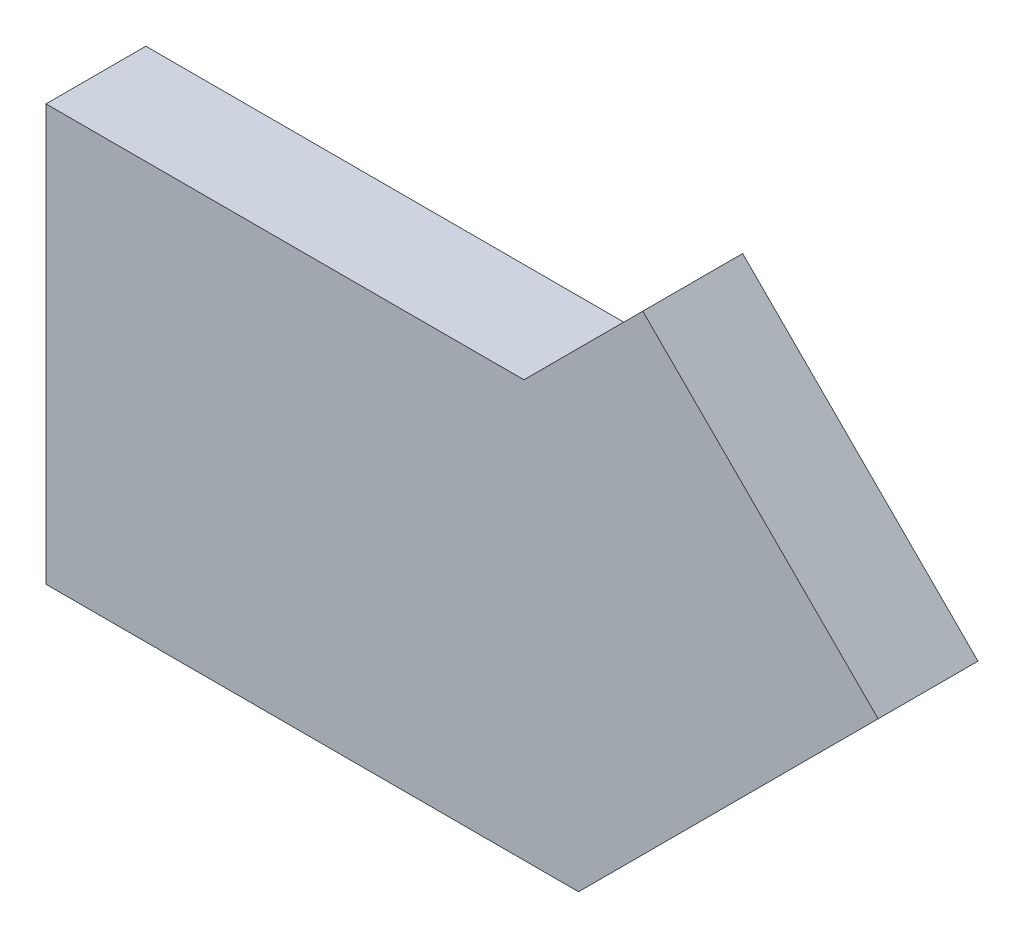
ISO-10303-21;
HEADER;
FILE_DESCRIPTION(('STEP AP214'),'2;1');
FILE_NAME('part.step','',(''),(''),'','','');
FILE_SCHEMA(('AUTOMOTIVE_DESIGN { 1 0 10303 214 1 1 1 1 }'));
ENDSEC;
DATA;
#1=APPLICATION_CONTEXT('core data for automotive mechanical design processes');
#2=APPLICATION_PROTOCOL_DEFINITION('international standard','automotive_design',2000,#1);
#3=PRODUCT_CONTEXT('',#1,'mechanical');
#4=PRODUCT('Part','Part','',(#3));
#5=PRODUCT_RELATED_PRODUCT_CATEGORY('part','',(#4));
#6=PRODUCT_DEFINITION_FORMATION('','',#4);
#7=PRODUCT_DEFINITION_CONTEXT('part definition',#1,'design');
#8=PRODUCT_DEFINITION('design','',#6,#7);
#9=PRODUCT_DEFINITION_SHAPE('','',#8);
#10=(LENGTH_UNIT() NAMED_UNIT(*) SI_UNIT(.MILLI.,.METRE.));
#11=(NAMED_UNIT(*) PLANE_ANGLE_UNIT() SI_UNIT($,.RADIAN.));
#12=(NAMED_UNIT(*) SI_UNIT($,.STERADIAN.) SOLID_ANGLE_UNIT());
#13=UNCERTAINTY_MEASURE_WITH_UNIT(LENGTH_MEASURE(1.E-05),#10,'distance_accuracy_value','');
#14=(GEOMETRIC_REPRESENTATION_CONTEXT(3) GLOBAL_UNCERTAINTY_ASSIGNED_CONTEXT((#13)) GLOBAL_UNIT_ASSIGNED_CONTEXT((#10,
#11,#12)) REPRESENTATION_CONTEXT('',''));
#15=CARTESIAN_POINT('',(0.,0.,0.));
#16=DIRECTION('',(0.,0.,1.));
#17=DIRECTION('',(1.,0.,0.));
#18=AXIS2_PLACEMENT_3D('',#15,#16,#17);
#19=CARTESIAN_POINT('',(0.,25.,6.));
#20=DIRECTION('',(1.,0.,0.));
#21=DIRECTION('',(0.,1.,0.));
#22=AXIS2_PLACEMENT_3D('',#19,#20,#21);
#23=PLANE('',#22);
#24=DIRECTION('',(0.,-1.,0.));
#25=VECTOR('',#24,1.);
#26=CARTESIAN_POINT('',(0.,25.,0.));
#27=LINE('',#26,#25);
#28=CARTESIAN_POINT('',(0.,25.,0.));
#29=VERTEX_POINT('',#28);
#30=CARTESIAN_POINT('',(0.,0.,0.));
#31=VERTEX_POINT('',#30);
#32=EDGE_CURVE('E116',#29,#31,#27,.T.);
#33=ORIENTED_EDGE('',*,*,#32,.T.);
#34=DIRECTION('',(0.,0.,-1.));
#35=VECTOR('',#34,1.);
#36=CARTESIAN_POINT('',(0.,0.,6.));
#37=LINE('',#36,#35);
#38=CARTESIAN_POINT('',(0.,0.,6.));
#39=VERTEX_POINT('',#38);
#40=EDGE_CURVE('E11',#39,#31,#37,.T.);
#41=ORIENTED_EDGE('',*,*,#40,.F.);
#42=DIRECTION('',(0.,-1.,0.));
#43=VECTOR('',#42,1.);
#44=CARTESIAN_POINT('',(0.,25.,6.));
#45=LINE('',#44,#43);
#46=CARTESIAN_POINT('',(0.,25.,6.));
#47=VERTEX_POINT('',#46);
#48=EDGE_CURVE('E126',#47,#39,#45,.T.);
#49=ORIENTED_EDGE('',*,*,#48,.F.);
#50=DIRECTION('',(0.,0.,-1.));
#51=VECTOR('',#50,1.);
#52=CARTESIAN_POINT('',(0.,25.,6.));
#53=LINE('',#52,#51);
#54=EDGE_CURVE('E112',#47,#29,#53,.T.);
#55=ORIENTED_EDGE('',*,*,#54,.T.);
#56=EDGE_LOOP('',(#33,#41,#49,#55));
#57=FACE_BOUND('',#56,.T.);
#58=ADVANCED_FACE('F32',(#57),#23,.F.);
#59=CARTESIAN_POINT('',(0.,0.,6.));
#60=DIRECTION('',(0.,1.,0.));
#61=DIRECTION('',(0.,0.,1.));
#62=AXIS2_PLACEMENT_3D('',#59,#60,#61);
#63=PLANE('',#62);
#64=DIRECTION('',(1.,0.,0.));
#65=VECTOR('',#64,1.);
#66=CARTESIAN_POINT('',(0.,0.,0.));
#67=LINE('',#66,#65);
#68=CARTESIAN_POINT('',(32.,0.,0.));
#69=VERTEX_POINT('',#68);
#70=EDGE_CURVE('E119',#31,#69,#67,.T.);
#71=ORIENTED_EDGE('',*,*,#70,.T.);
#72=DIRECTION('',(0.,0.,-1.));
#73=VECTOR('',#72,1.);
#74=CARTESIAN_POINT('',(32.,0.,6.));
#75=LINE('',#74,#73);
#76=CARTESIAN_POINT('',(32.,0.,6.));
#77=VERTEX_POINT('',#76);
#78=EDGE_CURVE('E40',#77,#69,#75,.T.);
#79=ORIENTED_EDGE('',*,*,#78,.F.);
#80=DIRECTION('',(1.,0.,0.));
#81=VECTOR('',#80,1.);
#82=CARTESIAN_POINT('',(0.,0.,6.));
#83=LINE('',#82,#81);
#84=EDGE_CURVE('E85',#39,#77,#83,.T.);
#85=ORIENTED_EDGE('',*,*,#84,.F.);
#86=ORIENTED_EDGE('',*,*,#40,.T.);
#87=EDGE_LOOP('',(#71,#79,#85,#86));
#88=FACE_BOUND('',#87,.T.);
#89=ADVANCED_FACE('F150',(#88),#63,.F.);
#90=CARTESIAN_POINT('',(32.,0.,6.));
#91=DIRECTION('',(-0.707106781186549,0.707106781186546,0.));
#92=DIRECTION('',(-0.707106781186546,-0.707106781186549,0.));
#93=AXIS2_PLACEMENT_3D('',#90,#91,#92);
#94=PLANE('',#93);
#95=DIRECTION('',(0.707106781186546,0.707106781186549,0.));
#96=VECTOR('',#95,1.);
#97=CARTESIAN_POINT('',(32.,0.,0.));
#98=LINE('',#97,#96);
#99=CARTESIAN_POINT('',(50.,18.0000000000001,0.));
#100=VERTEX_POINT('',#99);
#101=EDGE_CURVE('E121',#69,#100,#98,.T.);
#102=ORIENTED_EDGE('',*,*,#101,.T.);
#103=DIRECTION('',(0.,0.,-1.));
#104=VECTOR('',#103,1.);
#105=CARTESIAN_POINT('',(50.,18.0000000000001,6.));
#106=LINE('',#105,#104);
#107=CARTESIAN_POINT('',(50.,18.0000000000001,6.));
#108=VERTEX_POINT('',#107);
#109=EDGE_CURVE('E107',#108,#100,#106,.T.);
#110=ORIENTED_EDGE('',*,*,#109,.F.);
#111=DIRECTION('',(0.707106781186546,0.707106781186549,0.));
#112=VECTOR('',#111,1.);
#113=CARTESIAN_POINT('',(32.,0.,6.));
#114=LINE('',#113,#112);
#115=EDGE_CURVE('E98',#77,#108,#114,.T.);
#116=ORIENTED_EDGE('',*,*,#115,.F.);
#117=ORIENTED_EDGE('',*,*,#78,.T.);
#118=EDGE_LOOP('',(#102,#110,#116,#117));
#119=FACE_BOUND('',#118,.T.);
#120=ADVANCED_FACE('F132',(#119),#94,.F.);
#121=CARTESIAN_POINT('',(50.,18.0000000000001,6.));
#122=DIRECTION('',(-0.707106781186546,-0.707106781186549,0.));
#123=DIRECTION('',(0.707106781186549,-0.707106781186546,0.));
#124=AXIS2_PLACEMENT_3D('',#121,#122,#123);
#125=PLANE('',#124);
#126=DIRECTION('',(-0.707106781186549,0.707106781186546,0.));
#127=VECTOR('',#126,1.);
#128=CARTESIAN_POINT('',(50.,18.0000000000001,0.));
#129=LINE('',#128,#127);
#130=CARTESIAN_POINT('',(35.857864376269,32.142135623731,0.));
#131=VERTEX_POINT('',#130);
#132=EDGE_CURVE('E106',#100,#131,#129,.T.);
#133=ORIENTED_EDGE('',*,*,#132,.T.);
#134=DIRECTION('',(0.,0.,-1.));
#135=VECTOR('',#134,1.);
#136=CARTESIAN_POINT('',(35.857864376269,32.142135623731,6.));
#137=LINE('',#136,#135);
#138=CARTESIAN_POINT('',(35.857864376269,32.142135623731,6.));
#139=VERTEX_POINT('',#138);
#140=EDGE_CURVE('E103',#139,#131,#137,.T.);
#141=ORIENTED_EDGE('',*,*,#140,.F.);
#142=DIRECTION('',(-0.707106781186549,0.707106781186546,0.));
#143=VECTOR('',#142,1.);
#144=CARTESIAN_POINT('',(50.,18.0000000000001,6.));
#145=LINE('',#144,#143);
#146=EDGE_CURVE('E92',#108,#139,#145,.T.);
#147=ORIENTED_EDGE('',*,*,#146,.F.);
#148=ORIENTED_EDGE('',*,*,#109,.T.);
#149=EDGE_LOOP('',(#133,#141,#147,#148));
#150=FACE_BOUND('',#149,.T.);
#151=ADVANCED_FACE('F104',(#150),#125,.F.);
#152=CARTESIAN_POINT('',(35.857864376269,32.142135623731,6.));
#153=DIRECTION('',(0.707106781186549,-0.707106781186546,0.));
#154=DIRECTION('',(0.707106781186546,0.707106781186549,0.));
#155=AXIS2_PLACEMENT_3D('',#152,#153,#154);
#156=PLANE('',#155);
#157=DIRECTION('',(-0.707106781186546,-0.707106781186549,0.));
#158=VECTOR('',#157,1.);
#159=CARTESIAN_POINT('',(35.857864376269,32.142135623731,0.));
#160=LINE('',#159,#158);
#161=CARTESIAN_POINT('',(28.7157287525381,25.,0.));
#162=VERTEX_POINT('',#161);
#163=EDGE_CURVE('E71',#131,#162,#160,.T.);
#164=ORIENTED_EDGE('',*,*,#163,.T.);
#165=DIRECTION('',(0.,0.,-1.));
#166=VECTOR('',#165,1.);
#167=CARTESIAN_POINT('',(28.7157287525381,25.,6.));
#168=LINE('',#167,#166);
#169=CARTESIAN_POINT('',(28.7157287525381,25.,6.));
#170=VERTEX_POINT('',#169);
#171=EDGE_CURVE('E108',#170,#162,#168,.T.);
#172=ORIENTED_EDGE('',*,*,#171,.F.);
#173=DIRECTION('',(-0.707106781186546,-0.707106781186549,0.));
#174=VECTOR('',#173,1.);
#175=CARTESIAN_POINT('',(35.857864376269,32.142135623731,6.));
#176=LINE('',#175,#174);
#177=EDGE_CURVE('E96',#139,#170,#176,.T.);
#178=ORIENTED_EDGE('',*,*,#177,.F.);
#179=ORIENTED_EDGE('',*,*,#140,.T.);
#180=EDGE_LOOP('',(#164,#172,#178,#179));
#181=FACE_BOUND('',#180,.T.);
#182=ADVANCED_FACE('F110',(#181),#156,.F.);
#183=CARTESIAN_POINT('',(28.7157287525381,25.,6.));
#184=DIRECTION('',(0.,-1.,0.));
#185=DIRECTION('',(1.,0.,0.));
#186=AXIS2_PLACEMENT_3D('',#183,#184,#185);
#187=PLANE('',#186);
#188=DIRECTION('',(-1.,0.,0.));
#189=VECTOR('',#188,1.);
#190=CARTESIAN_POINT('',(28.7157287525381,25.,0.));
#191=LINE('',#190,#189);
#192=EDGE_CURVE('E77',#162,#29,#191,.T.);
#193=ORIENTED_EDGE('',*,*,#192,.T.);
#194=ORIENTED_EDGE('',*,*,#54,.F.);
#195=DIRECTION('',(-1.,0.,0.));
#196=VECTOR('',#195,1.);
#197=CARTESIAN_POINT('',(28.7157287525381,25.,6.));
#198=LINE('',#197,#196);
#199=EDGE_CURVE('E48',#170,#47,#198,.T.);
#200=ORIENTED_EDGE('',*,*,#199,.F.);
#201=ORIENTED_EDGE('',*,*,#171,.T.);
#202=EDGE_LOOP('',(#193,#194,#200,#201));
#203=FACE_BOUND('',#202,.T.);
#204=ADVANCED_FACE('F139',(#203),#187,.F.);
#205=CARTESIAN_POINT('',(0.,0.,6.));
#206=DIRECTION('',(0.,0.,1.));
#207=DIRECTION('',(1.,0.,0.));
#208=AXIS2_PLACEMENT_3D('',#205,#206,#207);
#209=PLANE('',#208);
#210=ORIENTED_EDGE('',*,*,#48,.T.);
#211=ORIENTED_EDGE('',*,*,#84,.T.);
#212=ORIENTED_EDGE('',*,*,#115,.T.);
#213=ORIENTED_EDGE('',*,*,#146,.T.);
#214=ORIENTED_EDGE('',*,*,#177,.T.);
#215=ORIENTED_EDGE('',*,*,#199,.T.);
#216=EDGE_LOOP('',(#210,#211,#212,#213,#214,#215));
#217=FACE_BOUND('',#216,.T.);
#218=ADVANCED_FACE('F94',(#217),#209,.T.);
#219=CARTESIAN_POINT('',(0.,0.,0.));
#220=DIRECTION('',(0.,0.,1.));
#221=DIRECTION('',(1.,0.,0.));
#222=AXIS2_PLACEMENT_3D('',#219,#220,#221);
#223=PLANE('',#222);
#224=ORIENTED_EDGE('',*,*,#32,.F.);
#225=ORIENTED_EDGE('',*,*,#192,.F.);
#226=ORIENTED_EDGE('',*,*,#163,.F.);
#227=ORIENTED_EDGE('',*,*,#132,.F.);
#228=ORIENTED_EDGE('',*,*,#101,.F.);
#229=ORIENTED_EDGE('',*,*,#70,.F.);
#230=EDGE_LOOP('',(#224,#225,#226,#227,#228,#229));
#231=FACE_BOUND('',#230,.T.);
#232=ADVANCED_FACE('F135',(#231),#223,.F.);
#233=CLOSED_SHELL('',(#58,#89,#120,#151,#182,#204,#218,#232));
#234=MANIFOLD_SOLID_BREP('B2',#233);
#235=ADVANCED_BREP_SHAPE_REPRESENTATION('',(#18,#234),#14);
#236=SHAPE_DEFINITION_REPRESENTATION(#9,#235);
ENDSEC;
END-ISO-10303-21;
